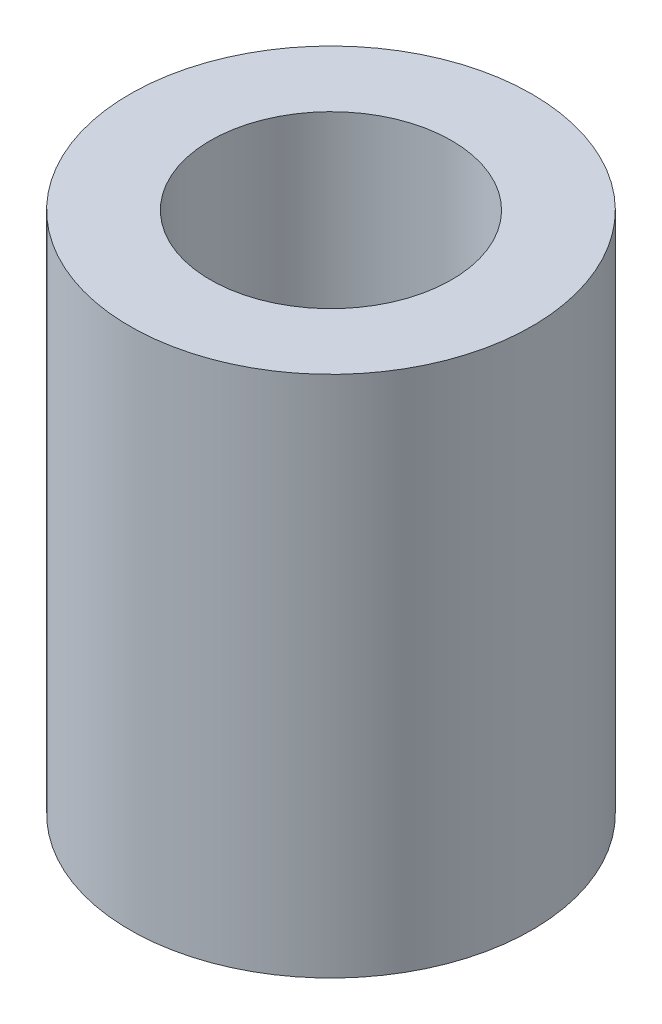
ISO-10303-21;
HEADER;
FILE_DESCRIPTION(('STEP AP214'),'2;1');
FILE_NAME('part.step','',(''),(''),'','','');
FILE_SCHEMA(('AUTOMOTIVE_DESIGN { 1 0 10303 214 1 1 1 1 }'));
ENDSEC;
DATA;
#1=APPLICATION_CONTEXT('core data for automotive mechanical design processes');
#2=APPLICATION_PROTOCOL_DEFINITION('international standard','automotive_design',2000,#1);
#3=PRODUCT_CONTEXT('',#1,'mechanical');
#4=PRODUCT('Part','Part','',(#3));
#5=PRODUCT_RELATED_PRODUCT_CATEGORY('part','',(#4));
#6=PRODUCT_DEFINITION_FORMATION('','',#4);
#7=PRODUCT_DEFINITION_CONTEXT('part definition',#1,'design');
#8=PRODUCT_DEFINITION('design','',#6,#7);
#9=PRODUCT_DEFINITION_SHAPE('','',#8);
#10=(LENGTH_UNIT() NAMED_UNIT(*) SI_UNIT(.MILLI.,.METRE.));
#11=(NAMED_UNIT(*) PLANE_ANGLE_UNIT() SI_UNIT($,.RADIAN.));
#12=(NAMED_UNIT(*) SI_UNIT($,.STERADIAN.) SOLID_ANGLE_UNIT());
#13=UNCERTAINTY_MEASURE_WITH_UNIT(LENGTH_MEASURE(1.E-05),#10,'distance_accuracy_value','');
#14=(GEOMETRIC_REPRESENTATION_CONTEXT(3) GLOBAL_UNCERTAINTY_ASSIGNED_CONTEXT((#13)) GLOBAL_UNIT_ASSIGNED_CONTEXT((#10,
#11,#12)) REPRESENTATION_CONTEXT('',''));
#15=CARTESIAN_POINT('',(0.,0.,0.));
#16=DIRECTION('',(0.,0.,1.));
#17=DIRECTION('',(1.,0.,0.));
#18=AXIS2_PLACEMENT_3D('',#15,#16,#17);
#19=CARTESIAN_POINT('',(0.,13.,0.));
#20=DIRECTION('',(0.,1.,0.));
#21=DIRECTION('',(0.,0.,1.));
#22=AXIS2_PLACEMENT_3D('',#19,#20,#21);
#23=PLANE('',#22);
#24=CARTESIAN_POINT('',(0.,13.,0.));
#25=DIRECTION('',(0.,1.,0.));
#26=DIRECTION('',(0.,0.,1.));
#27=AXIS2_PLACEMENT_3D('',#24,#25,#26);
#28=CIRCLE('',#27,5.);
#29=CARTESIAN_POINT('',(0.,13.,-5.));
#30=VERTEX_POINT('',#29);
#31=EDGE_CURVE('E10',#30,#30,#28,.T.);
#32=ORIENTED_EDGE('',*,*,#31,.T.);
#33=EDGE_LOOP('',(#32));
#34=FACE_BOUND('',#33,.T.);
#35=CARTESIAN_POINT('',(0.,13.,0.));
#36=DIRECTION('',(0.,1.,0.));
#37=DIRECTION('',(0.,0.,1.));
#38=AXIS2_PLACEMENT_3D('',#35,#36,#37);
#39=CIRCLE('',#38,3.);
#40=CARTESIAN_POINT('',(0.,13.,-3.));
#41=VERTEX_POINT('',#40);
#42=EDGE_CURVE('E39',#41,#41,#39,.T.);
#43=ORIENTED_EDGE('',*,*,#42,.F.);
#44=EDGE_LOOP('',(#43));
#45=FACE_BOUND('',#44,.T.);
#46=ADVANCED_FACE('F28',(#34,#45),#23,.T.);
#47=CARTESIAN_POINT('',(0.,0.,0.));
#48=DIRECTION('',(0.,1.,0.));
#49=DIRECTION('',(0.,0.,1.));
#50=AXIS2_PLACEMENT_3D('',#47,#48,#49);
#51=PLANE('',#50);
#52=CARTESIAN_POINT('',(0.,0.,0.));
#53=DIRECTION('',(0.,1.,0.));
#54=DIRECTION('',(0.,0.,1.));
#55=AXIS2_PLACEMENT_3D('',#52,#53,#54);
#56=CIRCLE('',#55,5.);
#57=CARTESIAN_POINT('',(0.,0.,-5.));
#58=VERTEX_POINT('',#57);
#59=EDGE_CURVE('E32',#58,#58,#56,.T.);
#60=ORIENTED_EDGE('',*,*,#59,.F.);
#61=EDGE_LOOP('',(#60));
#62=FACE_BOUND('',#61,.T.);
#63=CARTESIAN_POINT('',(0.,0.,0.));
#64=DIRECTION('',(0.,1.,0.));
#65=DIRECTION('',(0.,0.,1.));
#66=AXIS2_PLACEMENT_3D('',#63,#64,#65);
#67=CIRCLE('',#66,3.);
#68=CARTESIAN_POINT('',(0.,0.,-3.));
#69=VERTEX_POINT('',#68);
#70=EDGE_CURVE('E41',#69,#69,#67,.T.);
#71=ORIENTED_EDGE('',*,*,#70,.T.);
#72=EDGE_LOOP('',(#71));
#73=FACE_BOUND('',#72,.T.);
#74=ADVANCED_FACE('F51',(#62,#73),#51,.F.);
#75=CARTESIAN_POINT('',(0.,13.,0.));
#76=DIRECTION('',(0.,-1.,0.));
#77=DIRECTION('',(0.,0.,-1.));
#78=AXIS2_PLACEMENT_3D('',#75,#76,#77);
#79=CYLINDRICAL_SURFACE('',#78,5.);
#80=CARTESIAN_POINT('',(0.,13.,-5.));
#81=CARTESIAN_POINT('',(0.,12.8645833333333,-5.));
#82=CARTESIAN_POINT('',(0.,12.7291666666667,-5.));
#83=CARTESIAN_POINT('',(0.,12.4583333333333,-5.));
#84=CARTESIAN_POINT('',(0.,12.3229166666667,-5.));
#85=CARTESIAN_POINT('',(0.,12.0520833333333,-5.));
#86=CARTESIAN_POINT('',(0.,11.9166666666667,-5.));
#87=CARTESIAN_POINT('',(0.,11.6458333333333,-5.));
#88=CARTESIAN_POINT('',(0.,11.5104166666667,-5.));
#89=CARTESIAN_POINT('',(0.,11.2395833333333,-5.));
#90=CARTESIAN_POINT('',(0.,11.1041666666667,-5.));
#91=CARTESIAN_POINT('',(0.,10.8333333333333,-5.));
#92=CARTESIAN_POINT('',(0.,10.6979166666667,-5.));
#93=CARTESIAN_POINT('',(0.,10.4270833333333,-5.));
#94=CARTESIAN_POINT('',(0.,10.2916666666667,-5.));
#95=CARTESIAN_POINT('',(0.,10.0208333333333,-5.));
#96=CARTESIAN_POINT('',(0.,9.88541666666667,-5.));
#97=CARTESIAN_POINT('',(0.,9.61458333333333,-5.));
#98=CARTESIAN_POINT('',(0.,9.47916666666667,-5.));
#99=CARTESIAN_POINT('',(0.,9.20833333333333,-5.));
#100=CARTESIAN_POINT('',(0.,9.07291666666667,-5.));
#101=CARTESIAN_POINT('',(0.,8.80208333333333,-5.));
#102=CARTESIAN_POINT('',(0.,8.66666666666667,-5.));
#103=CARTESIAN_POINT('',(0.,8.39583333333333,-5.));
#104=CARTESIAN_POINT('',(0.,8.26041666666667,-5.));
#105=CARTESIAN_POINT('',(0.,7.98958333333333,-5.));
#106=CARTESIAN_POINT('',(0.,7.85416666666667,-5.));
#107=CARTESIAN_POINT('',(0.,7.58333333333333,-5.));
#108=CARTESIAN_POINT('',(0.,7.44791666666667,-5.));
#109=CARTESIAN_POINT('',(0.,7.17708333333333,-5.));
#110=CARTESIAN_POINT('',(0.,7.04166666666667,-5.));
#111=CARTESIAN_POINT('',(0.,6.77083333333333,-5.));
#112=CARTESIAN_POINT('',(0.,6.63541666666667,-5.));
#113=CARTESIAN_POINT('',(0.,6.36458333333333,-5.));
#114=CARTESIAN_POINT('',(0.,6.22916666666667,-5.));
#115=CARTESIAN_POINT('',(0.,5.95833333333333,-5.));
#116=CARTESIAN_POINT('',(0.,5.82291666666667,-5.));
#117=CARTESIAN_POINT('',(0.,5.55208333333333,-5.));
#118=CARTESIAN_POINT('',(0.,5.41666666666667,-5.));
#119=CARTESIAN_POINT('',(0.,5.14583333333333,-5.));
#120=CARTESIAN_POINT('',(0.,5.01041666666667,-5.));
#121=CARTESIAN_POINT('',(0.,4.73958333333333,-5.));
#122=CARTESIAN_POINT('',(0.,4.60416666666667,-5.));
#123=CARTESIAN_POINT('',(0.,4.33333333333333,-5.));
#124=CARTESIAN_POINT('',(0.,4.19791666666667,-5.));
#125=CARTESIAN_POINT('',(0.,3.92708333333333,-5.));
#126=CARTESIAN_POINT('',(0.,3.79166666666667,-5.));
#127=CARTESIAN_POINT('',(0.,3.52083333333333,-5.));
#128=CARTESIAN_POINT('',(0.,3.38541666666667,-5.));
#129=CARTESIAN_POINT('',(0.,3.11458333333333,-5.));
#130=CARTESIAN_POINT('',(0.,2.97916666666667,-5.));
#131=CARTESIAN_POINT('',(0.,2.70833333333333,-5.));
#132=CARTESIAN_POINT('',(0.,2.57291666666667,-5.));
#133=CARTESIAN_POINT('',(0.,2.30208333333333,-5.));
#134=CARTESIAN_POINT('',(0.,2.16666666666667,-5.));
#135=CARTESIAN_POINT('',(0.,1.89583333333333,-5.));
#136=CARTESIAN_POINT('',(0.,1.76041666666667,-5.));
#137=CARTESIAN_POINT('',(0.,1.48958333333333,-5.));
#138=CARTESIAN_POINT('',(0.,1.35416666666667,-5.));
#139=CARTESIAN_POINT('',(0.,1.08333333333333,-5.));
#140=CARTESIAN_POINT('',(0.,0.947916666666667,-5.));
#141=CARTESIAN_POINT('',(0.,0.677083333333334,-5.));
#142=CARTESIAN_POINT('',(0.,0.541666666666667,-5.));
#143=CARTESIAN_POINT('',(0.,0.270833333333334,-5.));
#144=CARTESIAN_POINT('',(0.,0.135416666666667,-5.));
#145=CARTESIAN_POINT('',(0.,0.,-5.));
#146=B_SPLINE_CURVE_WITH_KNOTS('',3,(#80,#81,#82,#83,#84,#85,#86,#87,#88,#89,#90,#91,#92,#93,
#94,#95,#96,#97,#98,#99,#100,#101,#102,#103,#104,#105,#106,#107,#108,#109,#110,#111,#112,#113,
#114,#115,#116,#117,#118,#119,#120,#121,#122,#123,#124,#125,#126,#127,#128,#129,#130,#131,#132,
#133,#134,#135,#136,#137,#138,#139,#140,#141,#142,#143,#144,#145),.UNSPECIFIED.,.F.,.F.,(4,2,2,
2,2,2,2,2,2,2,2,2,2,2,2,2,2,2,2,2,2,2,2,2,2,2,2,2,2,2,2,2,4),(0.,0.406249999999999,
0.812499999999999,1.21875,1.625,2.03125,2.4375,2.84375,3.25,3.65625,4.0625,4.46875,4.875,
5.28125,5.6875,6.09375,6.5,6.90625,7.3125,7.71875,8.125,8.53125,8.9375,9.34375,9.75,10.15625,
10.5625,10.96875,11.375,11.78125,12.1875,12.59375,13.),.UNSPECIFIED.);
#147=EDGE_CURVE('BSEAM30',#30,#58,#146,.T.);
#148=ORIENTED_EDGE('',*,*,#31,.F.);
#149=ORIENTED_EDGE('',*,*,#59,.T.);
#150=ORIENTED_EDGE('',*,*,#147,.T.);
#151=ORIENTED_EDGE('',*,*,#147,.F.);
#152=EDGE_LOOP('',(#148,#150,#149,#151));
#153=FACE_BOUND('',#152,.T.);
#154=ADVANCED_FACE('F30',(#153),#79,.T.);
#155=CARTESIAN_POINT('',(0.,13.,0.));
#156=DIRECTION('',(0.,-1.,0.));
#157=DIRECTION('',(0.,0.,-1.));
#158=AXIS2_PLACEMENT_3D('',#155,#156,#157);
#159=CYLINDRICAL_SURFACE('',#158,3.);
#160=CARTESIAN_POINT('',(0.,13.,-3.));
#161=CARTESIAN_POINT('',(0.,12.8645833333333,-3.));
#162=CARTESIAN_POINT('',(0.,12.7291666666667,-3.));
#163=CARTESIAN_POINT('',(0.,12.4583333333333,-3.));
#164=CARTESIAN_POINT('',(0.,12.3229166666667,-3.));
#165=CARTESIAN_POINT('',(0.,12.0520833333333,-3.));
#166=CARTESIAN_POINT('',(0.,11.9166666666667,-3.));
#167=CARTESIAN_POINT('',(0.,11.6458333333333,-3.));
#168=CARTESIAN_POINT('',(0.,11.5104166666667,-3.));
#169=CARTESIAN_POINT('',(0.,11.2395833333333,-3.));
#170=CARTESIAN_POINT('',(0.,11.1041666666667,-3.));
#171=CARTESIAN_POINT('',(0.,10.8333333333333,-3.));
#172=CARTESIAN_POINT('',(0.,10.6979166666667,-3.));
#173=CARTESIAN_POINT('',(0.,10.4270833333333,-3.));
#174=CARTESIAN_POINT('',(0.,10.2916666666667,-3.));
#175=CARTESIAN_POINT('',(0.,10.0208333333333,-3.));
#176=CARTESIAN_POINT('',(0.,9.88541666666667,-3.));
#177=CARTESIAN_POINT('',(0.,9.61458333333333,-3.));
#178=CARTESIAN_POINT('',(0.,9.47916666666667,-3.));
#179=CARTESIAN_POINT('',(0.,9.20833333333333,-3.));
#180=CARTESIAN_POINT('',(0.,9.07291666666667,-3.));
#181=CARTESIAN_POINT('',(0.,8.80208333333333,-3.));
#182=CARTESIAN_POINT('',(0.,8.66666666666667,-3.));
#183=CARTESIAN_POINT('',(0.,8.39583333333333,-3.));
#184=CARTESIAN_POINT('',(0.,8.26041666666667,-3.));
#185=CARTESIAN_POINT('',(0.,7.98958333333333,-3.));
#186=CARTESIAN_POINT('',(0.,7.85416666666667,-3.));
#187=CARTESIAN_POINT('',(0.,7.58333333333333,-3.));
#188=CARTESIAN_POINT('',(0.,7.44791666666667,-3.));
#189=CARTESIAN_POINT('',(0.,7.17708333333333,-3.));
#190=CARTESIAN_POINT('',(0.,7.04166666666667,-3.));
#191=CARTESIAN_POINT('',(0.,6.77083333333333,-3.));
#192=CARTESIAN_POINT('',(0.,6.63541666666667,-3.));
#193=CARTESIAN_POINT('',(0.,6.36458333333333,-3.));
#194=CARTESIAN_POINT('',(0.,6.22916666666667,-3.));
#195=CARTESIAN_POINT('',(0.,5.95833333333333,-3.));
#196=CARTESIAN_POINT('',(0.,5.82291666666667,-3.));
#197=CARTESIAN_POINT('',(0.,5.55208333333333,-3.));
#198=CARTESIAN_POINT('',(0.,5.41666666666667,-3.));
#199=CARTESIAN_POINT('',(0.,5.14583333333333,-3.));
#200=CARTESIAN_POINT('',(0.,5.01041666666667,-3.));
#201=CARTESIAN_POINT('',(0.,4.73958333333333,-3.));
#202=CARTESIAN_POINT('',(0.,4.60416666666667,-3.));
#203=CARTESIAN_POINT('',(0.,4.33333333333333,-3.));
#204=CARTESIAN_POINT('',(0.,4.19791666666667,-3.));
#205=CARTESIAN_POINT('',(0.,3.92708333333333,-3.));
#206=CARTESIAN_POINT('',(0.,3.79166666666667,-3.));
#207=CARTESIAN_POINT('',(0.,3.52083333333333,-3.));
#208=CARTESIAN_POINT('',(0.,3.38541666666667,-3.));
#209=CARTESIAN_POINT('',(0.,3.11458333333333,-3.));
#210=CARTESIAN_POINT('',(0.,2.97916666666667,-3.));
#211=CARTESIAN_POINT('',(0.,2.70833333333333,-3.));
#212=CARTESIAN_POINT('',(0.,2.57291666666667,-3.));
#213=CARTESIAN_POINT('',(0.,2.30208333333333,-3.));
#214=CARTESIAN_POINT('',(0.,2.16666666666667,-3.));
#215=CARTESIAN_POINT('',(0.,1.89583333333333,-3.));
#216=CARTESIAN_POINT('',(0.,1.76041666666667,-3.));
#217=CARTESIAN_POINT('',(0.,1.48958333333333,-3.));
#218=CARTESIAN_POINT('',(0.,1.35416666666667,-3.));
#219=CARTESIAN_POINT('',(0.,1.08333333333333,-3.));
#220=CARTESIAN_POINT('',(0.,0.947916666666667,-3.));
#221=CARTESIAN_POINT('',(0.,0.677083333333334,-3.));
#222=CARTESIAN_POINT('',(0.,0.541666666666667,-3.));
#223=CARTESIAN_POINT('',(0.,0.270833333333334,-3.));
#224=CARTESIAN_POINT('',(0.,0.135416666666667,-3.));
#225=CARTESIAN_POINT('',(0.,0.,-3.));
#226=B_SPLINE_CURVE_WITH_KNOTS('',3,(#160,#161,#162,#163,#164,#165,#166,#167,#168,#169,#170,
#171,#172,#173,#174,#175,#176,#177,#178,#179,#180,#181,#182,#183,#184,#185,#186,#187,#188,#189,
#190,#191,#192,#193,#194,#195,#196,#197,#198,#199,#200,#201,#202,#203,#204,#205,#206,#207,#208,
#209,#210,#211,#212,#213,#214,#215,#216,#217,#218,#219,#220,#221,#222,#223,#224,#225),
.UNSPECIFIED.,.F.,.F.,(4,2,2,2,2,2,2,2,2,2,2,2,2,2,2,2,2,2,2,2,2,2,2,2,2,2,2,2,2,2,2,2,4),(0.,
0.406249999999999,0.812499999999999,1.21875,1.625,2.03125,2.4375,2.84375,3.25,3.65625,4.0625,
4.46875,4.875,5.28125,5.6875,6.09375,6.5,6.90625,7.3125,7.71875,8.125,8.53125,8.9375,9.34375,
9.75,10.15625,10.5625,10.96875,11.375,11.78125,12.1875,12.59375,13.),.UNSPECIFIED.);
#227=EDGE_CURVE('BSEAM47',#41,#69,#226,.T.);
#228=ORIENTED_EDGE('',*,*,#42,.T.);
#229=ORIENTED_EDGE('',*,*,#70,.F.);
#230=ORIENTED_EDGE('',*,*,#227,.T.);
#231=ORIENTED_EDGE('',*,*,#227,.F.);
#232=EDGE_LOOP('',(#228,#230,#229,#231));
#233=FACE_BOUND('',#232,.T.);
#234=ADVANCED_FACE('F47',(#233),#159,.F.);
#235=CLOSED_SHELL('',(#46,#74,#154,#234));
#236=MANIFOLD_SOLID_BREP('B2',#235);
#237=ADVANCED_BREP_SHAPE_REPRESENTATION('',(#18,#236),#14);
#238=SHAPE_DEFINITION_REPRESENTATION(#9,#237);
ENDSEC;
END-ISO-10303-21;
